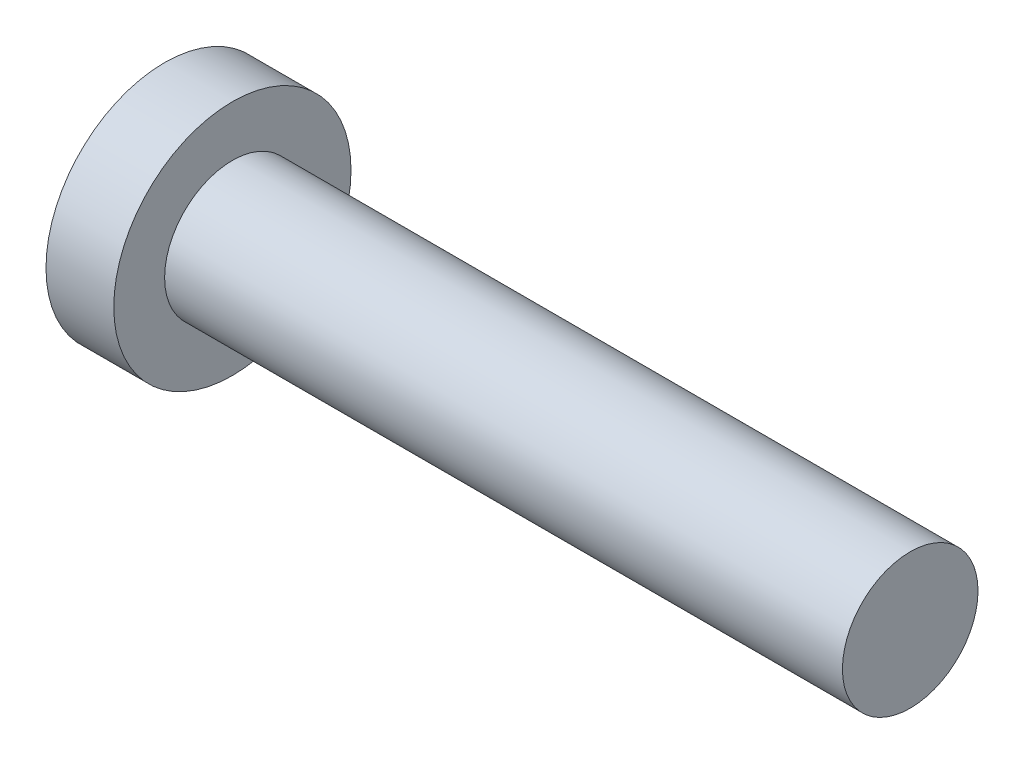
ISO-10303-21;
HEADER;
FILE_DESCRIPTION(('STEP AP214'),'2;1');
FILE_NAME('part.step','',(''),(''),'','','');
FILE_SCHEMA(('AUTOMOTIVE_DESIGN { 1 0 10303 214 1 1 1 1 }'));
ENDSEC;
DATA;
#1=APPLICATION_CONTEXT('core data for automotive mechanical design processes');
#2=APPLICATION_PROTOCOL_DEFINITION('international standard','automotive_design',2000,#1);
#3=PRODUCT_CONTEXT('',#1,'mechanical');
#4=PRODUCT('Part','Part','',(#3));
#5=PRODUCT_RELATED_PRODUCT_CATEGORY('part','',(#4));
#6=PRODUCT_DEFINITION_FORMATION('','',#4);
#7=PRODUCT_DEFINITION_CONTEXT('part definition',#1,'design');
#8=PRODUCT_DEFINITION('design','',#6,#7);
#9=PRODUCT_DEFINITION_SHAPE('','',#8);
#10=(LENGTH_UNIT() NAMED_UNIT(*) SI_UNIT(.MILLI.,.METRE.));
#11=(NAMED_UNIT(*) PLANE_ANGLE_UNIT() SI_UNIT($,.RADIAN.));
#12=(NAMED_UNIT(*) SI_UNIT($,.STERADIAN.) SOLID_ANGLE_UNIT());
#13=UNCERTAINTY_MEASURE_WITH_UNIT(LENGTH_MEASURE(1.E-05),#10,'distance_accuracy_value','');
#14=(GEOMETRIC_REPRESENTATION_CONTEXT(3) GLOBAL_UNCERTAINTY_ASSIGNED_CONTEXT((#13)) GLOBAL_UNIT_ASSIGNED_CONTEXT((#10,
#11,#12)) REPRESENTATION_CONTEXT('',''));
#15=CARTESIAN_POINT('',(0.,0.,0.));
#16=DIRECTION('',(0.,0.,1.));
#17=DIRECTION('',(1.,0.,0.));
#18=AXIS2_PLACEMENT_3D('',#15,#16,#17);
#19=CARTESIAN_POINT('',(10.,0.,0.));
#20=DIRECTION('',(-1.,0.,0.));
#21=DIRECTION('',(0.,0.,1.));
#22=AXIS2_PLACEMENT_3D('',#19,#20,#21);
#23=CYLINDRICAL_SURFACE('',#22,1.);
#24=CARTESIAN_POINT('',(10.,0.,0.));
#25=DIRECTION('',(1.,0.,0.));
#26=DIRECTION('',(0.,0.,-1.));
#27=AXIS2_PLACEMENT_3D('',#24,#25,#26);
#28=CIRCLE('',#27,1.);
#29=CARTESIAN_POINT('',(10.,0.,-1.));
#30=VERTEX_POINT('',#29);
#31=EDGE_CURVE('E10',#30,#30,#28,.T.);
#32=ORIENTED_EDGE('',*,*,#31,.F.);
#33=EDGE_LOOP('',(#32));
#34=FACE_BOUND('',#33,.T.);
#35=CARTESIAN_POINT('',(0.,0.,0.));
#36=DIRECTION('',(-1.,0.,0.));
#37=DIRECTION('',(0.,0.,1.));
#38=AXIS2_PLACEMENT_3D('',#35,#36,#37);
#39=CIRCLE('',#38,1.);
#40=CARTESIAN_POINT('',(0.,0.,1.));
#41=VERTEX_POINT('',#40);
#42=EDGE_CURVE('E39',#41,#41,#39,.T.);
#43=ORIENTED_EDGE('',*,*,#42,.F.);
#44=EDGE_LOOP('',(#43));
#45=FACE_BOUND('',#44,.T.);
#46=ADVANCED_FACE('F33',(#34,#45),#23,.T.);
#47=CARTESIAN_POINT('',(10.,0.,0.));
#48=DIRECTION('',(1.,0.,0.));
#49=DIRECTION('',(0.,0.,-1.));
#50=AXIS2_PLACEMENT_3D('',#47,#48,#49);
#51=PLANE('',#50);
#52=ORIENTED_EDGE('',*,*,#31,.T.);
#53=EDGE_LOOP('',(#52));
#54=FACE_BOUND('',#53,.T.);
#55=ADVANCED_FACE('F66',(#54),#51,.T.);
#56=CARTESIAN_POINT('',(-1.,0.,0.));
#57=DIRECTION('',(1.,0.,0.));
#58=DIRECTION('',(0.,0.,-1.));
#59=AXIS2_PLACEMENT_3D('',#56,#57,#58);
#60=CYLINDRICAL_SURFACE('',#59,1.75);
#61=CARTESIAN_POINT('',(-1.,0.,0.));
#62=DIRECTION('',(-1.,0.,0.));
#63=DIRECTION('',(0.,0.,1.));
#64=AXIS2_PLACEMENT_3D('',#61,#62,#63);
#65=CIRCLE('',#64,1.75);
#66=CARTESIAN_POINT('',(-1.,0.,1.75));
#67=VERTEX_POINT('',#66);
#68=EDGE_CURVE('E43',#67,#67,#65,.T.);
#69=ORIENTED_EDGE('',*,*,#68,.F.);
#70=EDGE_LOOP('',(#69));
#71=FACE_BOUND('',#70,.T.);
#72=CARTESIAN_POINT('',(0.,0.,0.));
#73=DIRECTION('',(-1.,0.,0.));
#74=DIRECTION('',(0.,0.,1.));
#75=AXIS2_PLACEMENT_3D('',#72,#73,#74);
#76=CIRCLE('',#75,1.75);
#77=CARTESIAN_POINT('',(0.,0.,1.75));
#78=VERTEX_POINT('',#77);
#79=EDGE_CURVE('E47',#78,#78,#76,.T.);
#80=ORIENTED_EDGE('',*,*,#79,.T.);
#81=EDGE_LOOP('',(#80));
#82=FACE_BOUND('',#81,.T.);
#83=ADVANCED_FACE('F53',(#71,#82),#60,.T.);
#84=CARTESIAN_POINT('',(-1.,0.,0.));
#85=DIRECTION('',(-1.,0.,0.));
#86=DIRECTION('',(0.,0.,1.));
#87=AXIS2_PLACEMENT_3D('',#84,#85,#86);
#88=PLANE('',#87);
#89=ORIENTED_EDGE('',*,*,#68,.T.);
#90=EDGE_LOOP('',(#89));
#91=FACE_BOUND('',#90,.T.);
#92=ADVANCED_FACE('F57',(#91),#88,.T.);
#93=CARTESIAN_POINT('',(0.,0.,0.));
#94=DIRECTION('',(-1.,0.,0.));
#95=DIRECTION('',(0.,0.,1.));
#96=AXIS2_PLACEMENT_3D('',#93,#94,#95);
#97=PLANE('',#96);
#98=ORIENTED_EDGE('',*,*,#42,.T.);
#99=EDGE_LOOP('',(#98));
#100=FACE_BOUND('',#99,.T.);
#101=ORIENTED_EDGE('',*,*,#79,.F.);
#102=EDGE_LOOP('',(#101));
#103=FACE_BOUND('',#102,.T.);
#104=ADVANCED_FACE('F55',(#100,#103),#97,.F.);
#105=CLOSED_SHELL('',(#46,#55,#83,#92,#104));
#106=MANIFOLD_SOLID_BREP('B2',#105);
#107=ADVANCED_BREP_SHAPE_REPRESENTATION('',(#18,#106),#14);
#108=SHAPE_DEFINITION_REPRESENTATION(#9,#107);
ENDSEC;
END-ISO-10303-21;
